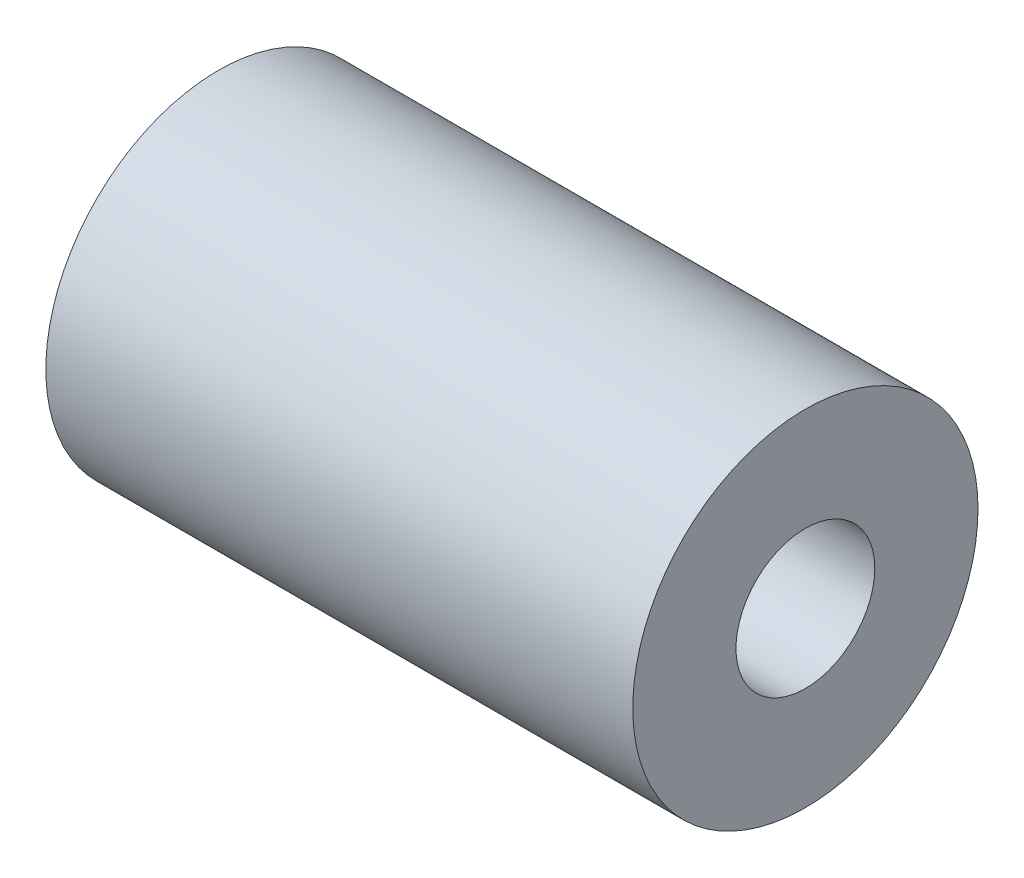
ISO-10303-21;
HEADER;
FILE_DESCRIPTION(('STEP AP214'),'2;1');
FILE_NAME('part.step','',(''),(''),'','','');
FILE_SCHEMA(('AUTOMOTIVE_DESIGN { 1 0 10303 214 1 1 1 1 }'));
ENDSEC;
DATA;
#1=APPLICATION_CONTEXT('core data for automotive mechanical design processes');
#2=APPLICATION_PROTOCOL_DEFINITION('international standard','automotive_design',2000,#1);
#3=PRODUCT_CONTEXT('',#1,'mechanical');
#4=PRODUCT('Part','Part','',(#3));
#5=PRODUCT_RELATED_PRODUCT_CATEGORY('part','',(#4));
#6=PRODUCT_DEFINITION_FORMATION('','',#4);
#7=PRODUCT_DEFINITION_CONTEXT('part definition',#1,'design');
#8=PRODUCT_DEFINITION('design','',#6,#7);
#9=PRODUCT_DEFINITION_SHAPE('','',#8);
#10=(LENGTH_UNIT() NAMED_UNIT(*) SI_UNIT(.MILLI.,.METRE.));
#11=(NAMED_UNIT(*) PLANE_ANGLE_UNIT() SI_UNIT($,.RADIAN.));
#12=(NAMED_UNIT(*) SI_UNIT($,.STERADIAN.) SOLID_ANGLE_UNIT());
#13=UNCERTAINTY_MEASURE_WITH_UNIT(LENGTH_MEASURE(1.E-05),#10,'distance_accuracy_value','');
#14=(GEOMETRIC_REPRESENTATION_CONTEXT(3) GLOBAL_UNCERTAINTY_ASSIGNED_CONTEXT((#13)) GLOBAL_UNIT_ASSIGNED_CONTEXT((#10,
#11,#12)) REPRESENTATION_CONTEXT('',''));
#15=CARTESIAN_POINT('',(0.,0.,0.));
#16=DIRECTION('',(0.,0.,1.));
#17=DIRECTION('',(1.,0.,0.));
#18=AXIS2_PLACEMENT_3D('',#15,#16,#17);
#19=CARTESIAN_POINT('',(21.59,0.,0.));
#20=DIRECTION('',(1.,0.,0.));
#21=DIRECTION('',(0.,0.,-1.));
#22=AXIS2_PLACEMENT_3D('',#19,#20,#21);
#23=PLANE('',#22);
#24=CARTESIAN_POINT('',(21.59,0.,0.));
#25=DIRECTION('',(1.,0.,0.));
#26=DIRECTION('',(0.,0.,-1.));
#27=AXIS2_PLACEMENT_3D('',#24,#25,#26);
#28=CIRCLE('',#27,6.35);
#29=CARTESIAN_POINT('',(21.59,0.,-6.35));
#30=VERTEX_POINT('',#29);
#31=EDGE_CURVE('E10',#30,#30,#28,.T.);
#32=ORIENTED_EDGE('',*,*,#31,.T.);
#33=EDGE_LOOP('',(#32));
#34=FACE_BOUND('',#33,.T.);
#35=CARTESIAN_POINT('',(21.59,0.,0.));
#36=DIRECTION('',(1.,0.,0.));
#37=DIRECTION('',(0.,0.,-1.));
#38=AXIS2_PLACEMENT_3D('',#35,#36,#37);
#39=CIRCLE('',#38,2.5527);
#40=CARTESIAN_POINT('',(21.59,0.,-2.5527));
#41=VERTEX_POINT('',#40);
#42=EDGE_CURVE('E42',#41,#41,#39,.T.);
#43=ORIENTED_EDGE('',*,*,#42,.F.);
#44=EDGE_LOOP('',(#43));
#45=FACE_BOUND('',#44,.T.);
#46=ADVANCED_FACE('F31',(#34,#45),#23,.T.);
#47=CARTESIAN_POINT('',(0.,0.,0.));
#48=DIRECTION('',(1.,0.,0.));
#49=DIRECTION('',(0.,0.,-1.));
#50=AXIS2_PLACEMENT_3D('',#47,#48,#49);
#51=PLANE('',#50);
#52=CARTESIAN_POINT('',(0.,0.,0.));
#53=DIRECTION('',(1.,0.,0.));
#54=DIRECTION('',(0.,0.,-1.));
#55=AXIS2_PLACEMENT_3D('',#52,#53,#54);
#56=CIRCLE('',#55,6.35);
#57=CARTESIAN_POINT('',(0.,0.,-6.35));
#58=VERTEX_POINT('',#57);
#59=EDGE_CURVE('E35',#58,#58,#56,.T.);
#60=ORIENTED_EDGE('',*,*,#59,.F.);
#61=EDGE_LOOP('',(#60));
#62=FACE_BOUND('',#61,.T.);
#63=CARTESIAN_POINT('',(0.,0.,0.));
#64=DIRECTION('',(1.,0.,0.));
#65=DIRECTION('',(0.,0.,-1.));
#66=AXIS2_PLACEMENT_3D('',#63,#64,#65);
#67=CIRCLE('',#66,2.5527);
#68=CARTESIAN_POINT('',(0.,0.,-2.5527));
#69=VERTEX_POINT('',#68);
#70=EDGE_CURVE('E44',#69,#69,#67,.T.);
#71=ORIENTED_EDGE('',*,*,#70,.T.);
#72=EDGE_LOOP('',(#71));
#73=FACE_BOUND('',#72,.T.);
#74=ADVANCED_FACE('F54',(#62,#73),#51,.F.);
#75=CARTESIAN_POINT('',(21.59,0.,0.));
#76=DIRECTION('',(-1.,0.,0.));
#77=DIRECTION('',(0.,0.,1.));
#78=AXIS2_PLACEMENT_3D('',#75,#76,#77);
#79=CYLINDRICAL_SURFACE('',#78,6.35);
#80=ORIENTED_EDGE('',*,*,#31,.F.);
#81=EDGE_LOOP('',(#80));
#82=FACE_BOUND('',#81,.T.);
#83=ORIENTED_EDGE('',*,*,#59,.T.);
#84=EDGE_LOOP('',(#83));
#85=FACE_BOUND('',#84,.T.);
#86=ADVANCED_FACE('F33',(#82,#85),#79,.T.);
#87=CARTESIAN_POINT('',(21.59,0.,0.));
#88=DIRECTION('',(-1.,0.,0.));
#89=DIRECTION('',(0.,0.,1.));
#90=AXIS2_PLACEMENT_3D('',#87,#88,#89);
#91=CYLINDRICAL_SURFACE('',#90,2.5527);
#92=ORIENTED_EDGE('',*,*,#42,.T.);
#93=EDGE_LOOP('',(#92));
#94=FACE_BOUND('',#93,.T.);
#95=ORIENTED_EDGE('',*,*,#70,.F.);
#96=EDGE_LOOP('',(#95));
#97=FACE_BOUND('',#96,.T.);
#98=ADVANCED_FACE('F50',(#94,#97),#91,.F.);
#99=CLOSED_SHELL('',(#46,#74,#86,#98));
#100=MANIFOLD_SOLID_BREP('B2',#99);
#101=ADVANCED_BREP_SHAPE_REPRESENTATION('',(#18,#100),#14);
#102=SHAPE_DEFINITION_REPRESENTATION(#9,#101);
ENDSEC;
END-ISO-10303-21;
